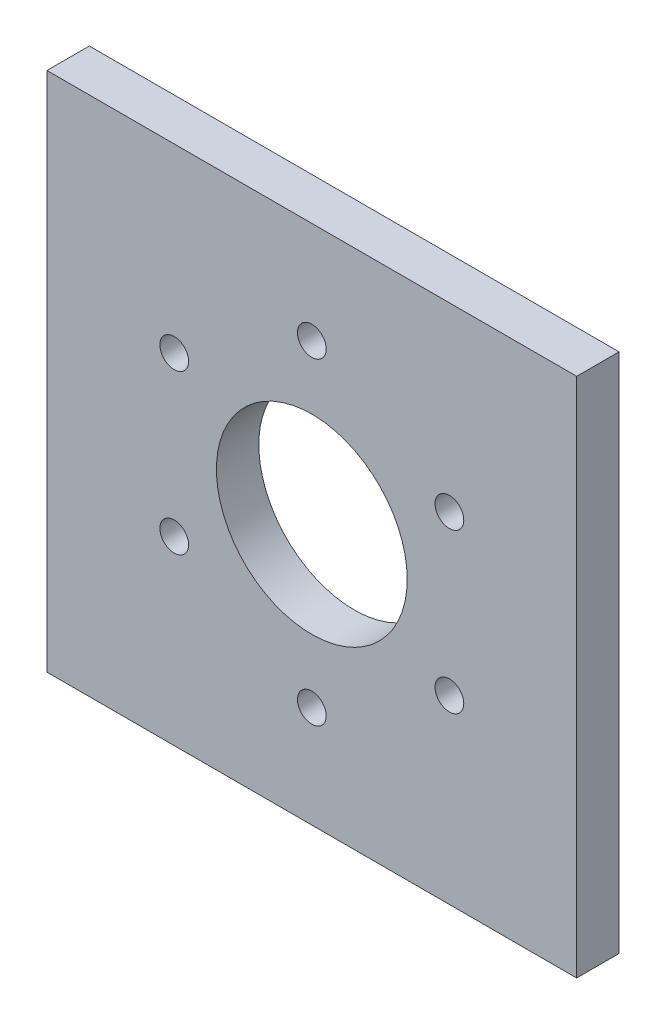
ISO-10303-21;
HEADER;
FILE_DESCRIPTION(('STEP AP214'),'2;1');
FILE_NAME('part.step','',(''),(''),'','','');
FILE_SCHEMA(('AUTOMOTIVE_DESIGN { 1 0 10303 214 1 1 1 1 }'));
ENDSEC;
DATA;
#1=APPLICATION_CONTEXT('core data for automotive mechanical design processes');
#2=APPLICATION_PROTOCOL_DEFINITION('international standard','automotive_design',2000,#1);
#3=PRODUCT_CONTEXT('',#1,'mechanical');
#4=PRODUCT('Part','Part','',(#3));
#5=PRODUCT_RELATED_PRODUCT_CATEGORY('part','',(#4));
#6=PRODUCT_DEFINITION_FORMATION('','',#4);
#7=PRODUCT_DEFINITION_CONTEXT('part definition',#1,'design');
#8=PRODUCT_DEFINITION('design','',#6,#7);
#9=PRODUCT_DEFINITION_SHAPE('','',#8);
#10=(LENGTH_UNIT() NAMED_UNIT(*) SI_UNIT(.MILLI.,.METRE.));
#11=(NAMED_UNIT(*) PLANE_ANGLE_UNIT() SI_UNIT($,.RADIAN.));
#12=(NAMED_UNIT(*) SI_UNIT($,.STERADIAN.) SOLID_ANGLE_UNIT());
#13=UNCERTAINTY_MEASURE_WITH_UNIT(LENGTH_MEASURE(1.E-05),#10,'distance_accuracy_value','');
#14=(GEOMETRIC_REPRESENTATION_CONTEXT(3) GLOBAL_UNCERTAINTY_ASSIGNED_CONTEXT((#13)) GLOBAL_UNIT_ASSIGNED_CONTEXT((#10,
#11,#12)) REPRESENTATION_CONTEXT('',''));
#15=CARTESIAN_POINT('',(0.,0.,0.));
#16=DIRECTION('',(0.,0.,1.));
#17=DIRECTION('',(1.,0.,0.));
#18=AXIS2_PLACEMENT_3D('',#15,#16,#17);
#19=CARTESIAN_POINT('',(0.,0.,6.35));
#20=DIRECTION('',(0.,0.,-1.));
#21=DIRECTION('',(-1.,0.,0.));
#22=AXIS2_PLACEMENT_3D('',#19,#20,#21);
#23=PLANE('',#22);
#24=DIRECTION('',(-1.,0.,0.));
#25=VECTOR('',#24,1.);
#26=CARTESIAN_POINT('',(-39.7,39.0525,6.35));
#27=LINE('',#26,#25);
#28=CARTESIAN_POINT('',(39.7,39.0525,6.35));
#29=VERTEX_POINT('',#28);
#30=CARTESIAN_POINT('',(-39.7,39.0525,6.35));
#31=VERTEX_POINT('',#30);
#32=EDGE_CURVE('E83',#29,#31,#27,.T.);
#33=ORIENTED_EDGE('',*,*,#32,.T.);
#34=DIRECTION('',(0.,-1.,0.));
#35=VECTOR('',#34,1.);
#36=CARTESIAN_POINT('',(-39.7,0.,6.35));
#37=LINE('',#36,#35);
#38=CARTESIAN_POINT('',(-39.7,-39.0525,6.35));
#39=VERTEX_POINT('',#38);
#40=EDGE_CURVE('E78',#31,#39,#37,.T.);
#41=ORIENTED_EDGE('',*,*,#40,.T.);
#42=DIRECTION('',(1.,0.,0.));
#43=VECTOR('',#42,1.);
#44=CARTESIAN_POINT('',(-39.7,-39.0525,6.35));
#45=LINE('',#44,#43);
#46=CARTESIAN_POINT('',(39.7,-39.0525,6.35));
#47=VERTEX_POINT('',#46);
#48=EDGE_CURVE('E81',#39,#47,#45,.T.);
#49=ORIENTED_EDGE('',*,*,#48,.T.);
#50=DIRECTION('',(0.,1.,0.));
#51=VECTOR('',#50,1.);
#52=CARTESIAN_POINT('',(39.7,-39.0525,6.35));
#53=LINE('',#52,#51);
#54=EDGE_CURVE('E50',#47,#29,#53,.T.);
#55=ORIENTED_EDGE('',*,*,#54,.T.);
#56=EDGE_LOOP('',(#33,#41,#49,#55));
#57=FACE_BOUND('',#56,.T.);
#58=CARTESIAN_POINT('',(0.,23.8125,6.35));
#59=DIRECTION('',(0.,0.,1.));
#60=DIRECTION('',(1.,0.,0.));
#61=AXIS2_PLACEMENT_3D('',#58,#59,#60);
#62=CIRCLE('',#61,2.15265);
#63=CARTESIAN_POINT('',(2.15265,23.8125,6.35));
#64=VERTEX_POINT('',#63);
#65=EDGE_CURVE('E99',#64,#64,#62,.T.);
#66=ORIENTED_EDGE('',*,*,#65,.F.);
#67=EDGE_LOOP('',(#66));
#68=FACE_BOUND('',#67,.T.);
#69=CARTESIAN_POINT('',(-20.6222299276168,11.9062500000002,6.35));
#70=DIRECTION('',(0.,0.,1.));
#71=DIRECTION('',(1.,0.,0.));
#72=AXIS2_PLACEMENT_3D('',#69,#70,#71);
#73=CIRCLE('',#72,2.15265);
#74=CARTESIAN_POINT('',(-18.4695799276168,11.9062500000002,6.35));
#75=VERTEX_POINT('',#74);
#76=EDGE_CURVE('E156',#75,#75,#73,.T.);
#77=ORIENTED_EDGE('',*,*,#76,.F.);
#78=EDGE_LOOP('',(#77));
#79=FACE_BOUND('',#78,.T.);
#80=CARTESIAN_POINT('',(0.,0.,6.35));
#81=DIRECTION('',(0.,0.,1.));
#82=DIRECTION('',(1.,0.,0.));
#83=AXIS2_PLACEMENT_3D('',#80,#81,#82);
#84=CIRCLE('',#83,14.3);
#85=CARTESIAN_POINT('',(14.3,0.,6.35));
#86=VERTEX_POINT('',#85);
#87=EDGE_CURVE('E151',#86,#86,#84,.T.);
#88=ORIENTED_EDGE('',*,*,#87,.F.);
#89=EDGE_LOOP('',(#88));
#90=FACE_BOUND('',#89,.T.);
#91=CARTESIAN_POINT('',(-20.622229927617,-11.9062499999998,6.35));
#92=DIRECTION('',(0.,0.,1.));
#93=DIRECTION('',(1.,0.,0.));
#94=AXIS2_PLACEMENT_3D('',#91,#92,#93);
#95=CIRCLE('',#94,2.15265);
#96=CARTESIAN_POINT('',(-18.469579927617,-11.9062499999998,6.35));
#97=VERTEX_POINT('',#96);
#98=EDGE_CURVE('E146',#97,#97,#95,.T.);
#99=ORIENTED_EDGE('',*,*,#98,.F.);
#100=EDGE_LOOP('',(#99));
#101=FACE_BOUND('',#100,.T.);
#102=CARTESIAN_POINT('',(0.,-23.8125,6.35));
#103=DIRECTION('',(0.,0.,1.));
#104=DIRECTION('',(1.,0.,0.));
#105=AXIS2_PLACEMENT_3D('',#102,#103,#104);
#106=CIRCLE('',#105,2.15265);
#107=CARTESIAN_POINT('',(2.15265,-23.8125,6.35));
#108=VERTEX_POINT('',#107);
#109=EDGE_CURVE('E141',#108,#108,#106,.T.);
#110=ORIENTED_EDGE('',*,*,#109,.F.);
#111=EDGE_LOOP('',(#110));
#112=FACE_BOUND('',#111,.T.);
#113=CARTESIAN_POINT('',(20.6222299276169,11.90625,6.35));
#114=DIRECTION('',(0.,0.,1.));
#115=DIRECTION('',(1.,0.,0.));
#116=AXIS2_PLACEMENT_3D('',#113,#114,#115);
#117=CIRCLE('',#116,2.15265);
#118=CARTESIAN_POINT('',(22.7748799276169,11.90625,6.35));
#119=VERTEX_POINT('',#118);
#120=EDGE_CURVE('E136',#119,#119,#117,.T.);
#121=ORIENTED_EDGE('',*,*,#120,.F.);
#122=EDGE_LOOP('',(#121));
#123=FACE_BOUND('',#122,.T.);
#124=CARTESIAN_POINT('',(20.6222299276169,-11.90625,6.35));
#125=DIRECTION('',(0.,0.,1.));
#126=DIRECTION('',(1.,0.,0.));
#127=AXIS2_PLACEMENT_3D('',#124,#125,#126);
#128=CIRCLE('',#127,2.15265);
#129=CARTESIAN_POINT('',(22.7748799276169,-11.90625,6.35));
#130=VERTEX_POINT('',#129);
#131=EDGE_CURVE('E130',#130,#130,#128,.T.);
#132=ORIENTED_EDGE('',*,*,#131,.F.);
#133=EDGE_LOOP('',(#132));
#134=FACE_BOUND('',#133,.T.);
#135=ADVANCED_FACE('F33',(#57,#68,#79,#90,#101,#112,#123,#134),#23,.F.);
#136=CARTESIAN_POINT('',(0.,0.,0.));
#137=DIRECTION('',(0.,0.,-1.));
#138=DIRECTION('',(-1.,0.,0.));
#139=AXIS2_PLACEMENT_3D('',#136,#137,#138);
#140=PLANE('',#139);
#141=CARTESIAN_POINT('',(20.6222299276169,11.90625,0.));
#142=DIRECTION('',(0.,0.,1.));
#143=DIRECTION('',(1.,0.,0.));
#144=AXIS2_PLACEMENT_3D('',#141,#142,#143);
#145=CIRCLE('',#144,2.15265);
#146=CARTESIAN_POINT('',(22.7748799276169,11.90625,0.));
#147=VERTEX_POINT('',#146);
#148=EDGE_CURVE('E133',#147,#147,#145,.T.);
#149=ORIENTED_EDGE('',*,*,#148,.T.);
#150=EDGE_LOOP('',(#149));
#151=FACE_BOUND('',#150,.T.);
#152=CARTESIAN_POINT('',(-20.622229927617,-11.9062499999998,0.));
#153=DIRECTION('',(0.,0.,1.));
#154=DIRECTION('',(1.,0.,0.));
#155=AXIS2_PLACEMENT_3D('',#152,#153,#154);
#156=CIRCLE('',#155,2.15265);
#157=CARTESIAN_POINT('',(-18.469579927617,-11.9062499999998,0.));
#158=VERTEX_POINT('',#157);
#159=EDGE_CURVE('E144',#158,#158,#156,.T.);
#160=ORIENTED_EDGE('',*,*,#159,.T.);
#161=EDGE_LOOP('',(#160));
#162=FACE_BOUND('',#161,.T.);
#163=CARTESIAN_POINT('',(-20.6222299276168,11.9062500000002,0.));
#164=DIRECTION('',(0.,0.,1.));
#165=DIRECTION('',(1.,0.,0.));
#166=AXIS2_PLACEMENT_3D('',#163,#164,#165);
#167=CIRCLE('',#166,2.15265);
#168=CARTESIAN_POINT('',(-18.4695799276168,11.9062500000002,0.));
#169=VERTEX_POINT('',#168);
#170=EDGE_CURVE('E154',#169,#169,#167,.T.);
#171=ORIENTED_EDGE('',*,*,#170,.T.);
#172=EDGE_LOOP('',(#171));
#173=FACE_BOUND('',#172,.T.);
#174=DIRECTION('',(0.,-1.,0.));
#175=VECTOR('',#174,1.);
#176=CARTESIAN_POINT('',(-39.7,0.,0.));
#177=LINE('',#176,#175);
#178=CARTESIAN_POINT('',(-39.7,39.0525,0.));
#179=VERTEX_POINT('',#178);
#180=CARTESIAN_POINT('',(-39.7,-39.0525,0.));
#181=VERTEX_POINT('',#180);
#182=EDGE_CURVE('E88',#179,#181,#177,.T.);
#183=ORIENTED_EDGE('',*,*,#182,.F.);
#184=DIRECTION('',(-1.,0.,0.));
#185=VECTOR('',#184,1.);
#186=CARTESIAN_POINT('',(0.,39.0525,0.));
#187=LINE('',#186,#185);
#188=CARTESIAN_POINT('',(39.7,39.0525,0.));
#189=VERTEX_POINT('',#188);
#190=EDGE_CURVE('E102',#189,#179,#187,.T.);
#191=ORIENTED_EDGE('',*,*,#190,.F.);
#192=DIRECTION('',(0.,1.,0.));
#193=VECTOR('',#192,1.);
#194=CARTESIAN_POINT('',(39.7,39.0525,0.));
#195=LINE('',#194,#193);
#196=CARTESIAN_POINT('',(39.7,-39.0525,0.));
#197=VERTEX_POINT('',#196);
#198=EDGE_CURVE('E66',#197,#189,#195,.T.);
#199=ORIENTED_EDGE('',*,*,#198,.F.);
#200=DIRECTION('',(1.,0.,0.));
#201=VECTOR('',#200,1.);
#202=CARTESIAN_POINT('',(0.,-39.0525,0.));
#203=LINE('',#202,#201);
#204=EDGE_CURVE('E98',#181,#197,#203,.T.);
#205=ORIENTED_EDGE('',*,*,#204,.F.);
#206=EDGE_LOOP('',(#183,#191,#199,#205));
#207=FACE_BOUND('',#206,.T.);
#208=CARTESIAN_POINT('',(0.,23.8125,0.));
#209=DIRECTION('',(0.,0.,1.));
#210=DIRECTION('',(1.,0.,0.));
#211=AXIS2_PLACEMENT_3D('',#208,#209,#210);
#212=CIRCLE('',#211,2.15265);
#213=CARTESIAN_POINT('',(2.15265,23.8125,0.));
#214=VERTEX_POINT('',#213);
#215=EDGE_CURVE('E117',#214,#214,#212,.T.);
#216=ORIENTED_EDGE('',*,*,#215,.T.);
#217=EDGE_LOOP('',(#216));
#218=FACE_BOUND('',#217,.T.);
#219=CARTESIAN_POINT('',(0.,0.,0.));
#220=DIRECTION('',(0.,0.,1.));
#221=DIRECTION('',(1.,0.,0.));
#222=AXIS2_PLACEMENT_3D('',#219,#220,#221);
#223=CIRCLE('',#222,14.3);
#224=CARTESIAN_POINT('',(14.3,0.,0.));
#225=VERTEX_POINT('',#224);
#226=EDGE_CURVE('E121',#225,#225,#223,.T.);
#227=ORIENTED_EDGE('',*,*,#226,.T.);
#228=EDGE_LOOP('',(#227));
#229=FACE_BOUND('',#228,.T.);
#230=CARTESIAN_POINT('',(0.,-23.8125,0.));
#231=DIRECTION('',(0.,0.,1.));
#232=DIRECTION('',(1.,0.,0.));
#233=AXIS2_PLACEMENT_3D('',#230,#231,#232);
#234=CIRCLE('',#233,2.15265);
#235=CARTESIAN_POINT('',(2.15265,-23.8125,0.));
#236=VERTEX_POINT('',#235);
#237=EDGE_CURVE('E125',#236,#236,#234,.T.);
#238=ORIENTED_EDGE('',*,*,#237,.T.);
#239=EDGE_LOOP('',(#238));
#240=FACE_BOUND('',#239,.T.);
#241=CARTESIAN_POINT('',(20.6222299276169,-11.90625,0.));
#242=DIRECTION('',(0.,0.,1.));
#243=DIRECTION('',(1.,0.,0.));
#244=AXIS2_PLACEMENT_3D('',#241,#242,#243);
#245=CIRCLE('',#244,2.15265);
#246=CARTESIAN_POINT('',(22.7748799276169,-11.90625,0.));
#247=VERTEX_POINT('',#246);
#248=EDGE_CURVE('E128',#247,#247,#245,.T.);
#249=ORIENTED_EDGE('',*,*,#248,.T.);
#250=EDGE_LOOP('',(#249));
#251=FACE_BOUND('',#250,.T.);
#252=ADVANCED_FACE('F109',(#151,#162,#173,#207,#218,#229,#240,#251),#140,.T.);
#253=CARTESIAN_POINT('',(-39.7,0.,6.35));
#254=DIRECTION('',(1.,0.,0.));
#255=DIRECTION('',(0.,0.,-1.));
#256=AXIS2_PLACEMENT_3D('',#253,#254,#255);
#257=PLANE('',#256);
#258=ORIENTED_EDGE('',*,*,#182,.T.);
#259=DIRECTION('',(0.,0.,-1.));
#260=VECTOR('',#259,1.);
#261=CARTESIAN_POINT('',(-39.7,-39.0525,6.35));
#262=LINE('',#261,#260);
#263=EDGE_CURVE('E42',#39,#181,#262,.T.);
#264=ORIENTED_EDGE('',*,*,#263,.F.);
#265=ORIENTED_EDGE('',*,*,#40,.F.);
#266=DIRECTION('',(0.,0.,-1.));
#267=VECTOR('',#266,1.);
#268=CARTESIAN_POINT('',(-39.7,39.0525,6.35));
#269=LINE('',#268,#267);
#270=EDGE_CURVE('E11',#31,#179,#269,.T.);
#271=ORIENTED_EDGE('',*,*,#270,.T.);
#272=EDGE_LOOP('',(#258,#264,#265,#271));
#273=FACE_BOUND('',#272,.T.);
#274=ADVANCED_FACE('F35',(#273),#257,.F.);
#275=CARTESIAN_POINT('',(0.,-39.0525,6.35));
#276=DIRECTION('',(0.,1.,0.));
#277=DIRECTION('',(0.,0.,1.));
#278=AXIS2_PLACEMENT_3D('',#275,#276,#277);
#279=PLANE('',#278);
#280=ORIENTED_EDGE('',*,*,#204,.T.);
#281=DIRECTION('',(0.,0.,-1.));
#282=VECTOR('',#281,1.);
#283=CARTESIAN_POINT('',(39.7,-39.0525,6.35));
#284=LINE('',#283,#282);
#285=EDGE_CURVE('E90',#47,#197,#284,.T.);
#286=ORIENTED_EDGE('',*,*,#285,.F.);
#287=ORIENTED_EDGE('',*,*,#48,.F.);
#288=ORIENTED_EDGE('',*,*,#263,.T.);
#289=EDGE_LOOP('',(#280,#286,#287,#288));
#290=FACE_BOUND('',#289,.T.);
#291=ADVANCED_FACE('F91',(#290),#279,.F.);
#292=CARTESIAN_POINT('',(39.7,39.0525,6.35));
#293=DIRECTION('',(-1.,0.,0.));
#294=DIRECTION('',(0.,0.,1.));
#295=AXIS2_PLACEMENT_3D('',#292,#293,#294);
#296=PLANE('',#295);
#297=ORIENTED_EDGE('',*,*,#198,.T.);
#298=DIRECTION('',(0.,0.,-1.));
#299=VECTOR('',#298,1.);
#300=CARTESIAN_POINT('',(39.7,39.0525,6.35));
#301=LINE('',#300,#299);
#302=EDGE_CURVE('E93',#29,#189,#301,.T.);
#303=ORIENTED_EDGE('',*,*,#302,.F.);
#304=ORIENTED_EDGE('',*,*,#54,.F.);
#305=ORIENTED_EDGE('',*,*,#285,.T.);
#306=EDGE_LOOP('',(#297,#303,#304,#305));
#307=FACE_BOUND('',#306,.T.);
#308=ADVANCED_FACE('F106',(#307),#296,.F.);
#309=CARTESIAN_POINT('',(0.,39.0525,6.35));
#310=DIRECTION('',(0.,-1.,0.));
#311=DIRECTION('',(0.,0.,-1.));
#312=AXIS2_PLACEMENT_3D('',#309,#310,#311);
#313=PLANE('',#312);
#314=ORIENTED_EDGE('',*,*,#190,.T.);
#315=ORIENTED_EDGE('',*,*,#270,.F.);
#316=ORIENTED_EDGE('',*,*,#32,.F.);
#317=ORIENTED_EDGE('',*,*,#302,.T.);
#318=EDGE_LOOP('',(#314,#315,#316,#317));
#319=FACE_BOUND('',#318,.T.);
#320=ADVANCED_FACE('F108',(#319),#313,.F.);
#321=CARTESIAN_POINT('',(0.,23.8125,6.35));
#322=DIRECTION('',(0.,0.,-1.));
#323=DIRECTION('',(-1.,0.,0.));
#324=AXIS2_PLACEMENT_3D('',#321,#322,#323);
#325=CYLINDRICAL_SURFACE('',#324,2.15265);
#326=ORIENTED_EDGE('',*,*,#215,.F.);
#327=EDGE_LOOP('',(#326));
#328=FACE_BOUND('',#327,.T.);
#329=ORIENTED_EDGE('',*,*,#65,.T.);
#330=EDGE_LOOP('',(#329));
#331=FACE_BOUND('',#330,.T.);
#332=ADVANCED_FACE('F165',(#328,#331),#325,.F.);
#333=CARTESIAN_POINT('',(-20.6222299276168,11.9062500000002,6.35));
#334=DIRECTION('',(0.,0.,-1.));
#335=DIRECTION('',(-1.,0.,0.));
#336=AXIS2_PLACEMENT_3D('',#333,#334,#335);
#337=CYLINDRICAL_SURFACE('',#336,2.15265);
#338=ORIENTED_EDGE('',*,*,#170,.F.);
#339=EDGE_LOOP('',(#338));
#340=FACE_BOUND('',#339,.T.);
#341=ORIENTED_EDGE('',*,*,#76,.T.);
#342=EDGE_LOOP('',(#341));
#343=FACE_BOUND('',#342,.T.);
#344=ADVANCED_FACE('F202',(#340,#343),#337,.F.);
#345=CARTESIAN_POINT('',(0.,0.,6.35));
#346=DIRECTION('',(0.,0.,-1.));
#347=DIRECTION('',(-1.,0.,0.));
#348=AXIS2_PLACEMENT_3D('',#345,#346,#347);
#349=CYLINDRICAL_SURFACE('',#348,14.3);
#350=ORIENTED_EDGE('',*,*,#226,.F.);
#351=EDGE_LOOP('',(#350));
#352=FACE_BOUND('',#351,.T.);
#353=ORIENTED_EDGE('',*,*,#87,.T.);
#354=EDGE_LOOP('',(#353));
#355=FACE_BOUND('',#354,.T.);
#356=ADVANCED_FACE('F198',(#352,#355),#349,.F.);
#357=CARTESIAN_POINT('',(-20.622229927617,-11.9062499999998,6.35));
#358=DIRECTION('',(0.,0.,-1.));
#359=DIRECTION('',(-1.,0.,0.));
#360=AXIS2_PLACEMENT_3D('',#357,#358,#359);
#361=CYLINDRICAL_SURFACE('',#360,2.15265);
#362=ORIENTED_EDGE('',*,*,#159,.F.);
#363=EDGE_LOOP('',(#362));
#364=FACE_BOUND('',#363,.T.);
#365=ORIENTED_EDGE('',*,*,#98,.T.);
#366=EDGE_LOOP('',(#365));
#367=FACE_BOUND('',#366,.T.);
#368=ADVANCED_FACE('F194',(#364,#367),#361,.F.);
#369=CARTESIAN_POINT('',(0.,-23.8125,6.35));
#370=DIRECTION('',(0.,0.,-1.));
#371=DIRECTION('',(-1.,0.,0.));
#372=AXIS2_PLACEMENT_3D('',#369,#370,#371);
#373=CYLINDRICAL_SURFACE('',#372,2.15265);
#374=ORIENTED_EDGE('',*,*,#237,.F.);
#375=EDGE_LOOP('',(#374));
#376=FACE_BOUND('',#375,.T.);
#377=ORIENTED_EDGE('',*,*,#109,.T.);
#378=EDGE_LOOP('',(#377));
#379=FACE_BOUND('',#378,.T.);
#380=ADVANCED_FACE('F188',(#376,#379),#373,.F.);
#381=CARTESIAN_POINT('',(20.6222299276169,11.90625,6.35));
#382=DIRECTION('',(0.,0.,-1.));
#383=DIRECTION('',(-1.,0.,0.));
#384=AXIS2_PLACEMENT_3D('',#381,#382,#383);
#385=CYLINDRICAL_SURFACE('',#384,2.15265);
#386=ORIENTED_EDGE('',*,*,#148,.F.);
#387=EDGE_LOOP('',(#386));
#388=FACE_BOUND('',#387,.T.);
#389=ORIENTED_EDGE('',*,*,#120,.T.);
#390=EDGE_LOOP('',(#389));
#391=FACE_BOUND('',#390,.T.);
#392=ADVANCED_FACE('F183',(#388,#391),#385,.F.);
#393=CARTESIAN_POINT('',(20.6222299276169,-11.90625,6.35));
#394=DIRECTION('',(0.,0.,-1.));
#395=DIRECTION('',(-1.,0.,0.));
#396=AXIS2_PLACEMENT_3D('',#393,#394,#395);
#397=CYLINDRICAL_SURFACE('',#396,2.15265);
#398=ORIENTED_EDGE('',*,*,#248,.F.);
#399=EDGE_LOOP('',(#398));
#400=FACE_BOUND('',#399,.T.);
#401=ORIENTED_EDGE('',*,*,#131,.T.);
#402=EDGE_LOOP('',(#401));
#403=FACE_BOUND('',#402,.T.);
#404=ADVANCED_FACE('F181',(#400,#403),#397,.F.);
#405=CLOSED_SHELL('',(#135,#252,#274,#291,#308,#320,#332,#344,#356,#368,#380,#392,#404));
#406=MANIFOLD_SOLID_BREP('B2',#405);
#407=ADVANCED_BREP_SHAPE_REPRESENTATION('',(#18,#406),#14);
#408=SHAPE_DEFINITION_REPRESENTATION(#9,#407);
ENDSEC;
END-ISO-10303-21;
